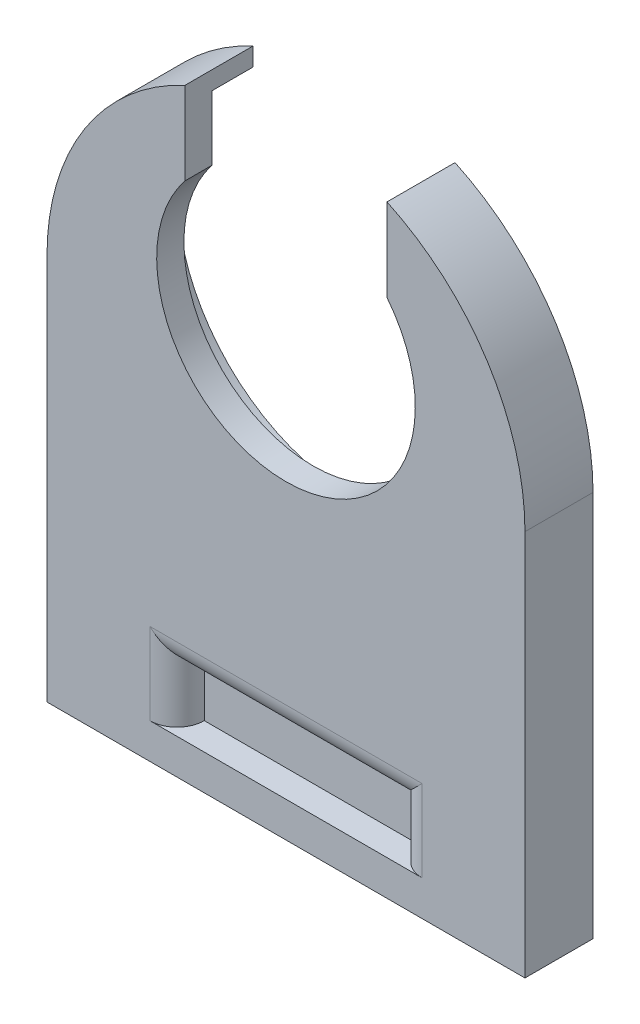
ISO-10303-21;
HEADER;
FILE_DESCRIPTION(('STEP AP214'),'2;1');
FILE_NAME('part.step','',(''),(''),'','','');
FILE_SCHEMA(('AUTOMOTIVE_DESIGN { 1 0 10303 214 1 1 1 1 }'));
ENDSEC;
DATA;
#1=APPLICATION_CONTEXT('core data for automotive mechanical design processes');
#2=APPLICATION_PROTOCOL_DEFINITION('international standard','automotive_design',2000,#1);
#3=PRODUCT_CONTEXT('',#1,'mechanical');
#4=PRODUCT('Part','Part','',(#3));
#5=PRODUCT_RELATED_PRODUCT_CATEGORY('part','',(#4));
#6=PRODUCT_DEFINITION_FORMATION('','',#4);
#7=PRODUCT_DEFINITION_CONTEXT('part definition',#1,'design');
#8=PRODUCT_DEFINITION('design','',#6,#7);
#9=PRODUCT_DEFINITION_SHAPE('','',#8);
#10=(LENGTH_UNIT() NAMED_UNIT(*) SI_UNIT(.MILLI.,.METRE.));
#11=(NAMED_UNIT(*) PLANE_ANGLE_UNIT() SI_UNIT($,.RADIAN.));
#12=(NAMED_UNIT(*) SI_UNIT($,.STERADIAN.) SOLID_ANGLE_UNIT());
#13=UNCERTAINTY_MEASURE_WITH_UNIT(LENGTH_MEASURE(1.E-05),#10,'distance_accuracy_value','');
#14=(GEOMETRIC_REPRESENTATION_CONTEXT(3) GLOBAL_UNCERTAINTY_ASSIGNED_CONTEXT((#13)) GLOBAL_UNIT_ASSIGNED_CONTEXT((#10,
#11,#12)) REPRESENTATION_CONTEXT('',''));
#15=CARTESIAN_POINT('',(0.,0.,0.));
#16=DIRECTION('',(0.,0.,1.));
#17=DIRECTION('',(1.,0.,0.));
#18=AXIS2_PLACEMENT_3D('',#15,#16,#17);
#19=CARTESIAN_POINT('',(8.78,8.5,1.5));
#20=DIRECTION('',(0.,0.,-1.));
#21=DIRECTION('',(-1.,0.,0.));
#22=AXIS2_PLACEMENT_3D('',#19,#20,#21);
#23=CYLINDRICAL_SURFACE('',#22,6.5);
#24=CARTESIAN_POINT('',(8.78,8.5,1.5));
#25=DIRECTION('',(0.,0.,1.));
#26=DIRECTION('',(1.,0.,0.));
#27=AXIS2_PLACEMENT_3D('',#24,#25,#26);
#28=CIRCLE('',#27,6.5);
#29=CARTESIAN_POINT('',(5.07,13.8372183766453,1.5));
#30=VERTEX_POINT('',#29);
#31=CARTESIAN_POINT('',(12.49,13.8372183766453,1.5));
#32=VERTEX_POINT('',#31);
#33=EDGE_CURVE('E151',#30,#32,#28,.T.);
#34=ORIENTED_EDGE('',*,*,#33,.T.);
#35=DIRECTION('',(0.,0.,-1.));
#36=VECTOR('',#35,1.);
#37=CARTESIAN_POINT('',(12.49,13.8372183766453,1.5));
#38=LINE('',#37,#36);
#39=CARTESIAN_POINT('',(12.49,13.8372183766453,0.));
#40=VERTEX_POINT('',#39);
#41=EDGE_CURVE('E137',#32,#40,#38,.T.);
#42=ORIENTED_EDGE('',*,*,#41,.T.);
#43=CARTESIAN_POINT('',(8.78,8.5,0.));
#44=DIRECTION('',(0.,0.,1.));
#45=DIRECTION('',(1.,0.,0.));
#46=AXIS2_PLACEMENT_3D('',#43,#44,#45);
#47=CIRCLE('',#46,6.5);
#48=CARTESIAN_POINT('',(5.07,13.8372183766453,0.));
#49=VERTEX_POINT('',#48);
#50=EDGE_CURVE('E149',#49,#40,#47,.T.);
#51=ORIENTED_EDGE('',*,*,#50,.F.);
#52=DIRECTION('',(0.,0.,-1.));
#53=VECTOR('',#52,1.);
#54=CARTESIAN_POINT('',(5.07,13.8372183766453,1.5));
#55=LINE('',#54,#53);
#56=EDGE_CURVE('E211',#49,#30,#55,.F.);
#57=ORIENTED_EDGE('',*,*,#56,.T.);
#58=EDGE_LOOP('',(#34,#42,#51,#57));
#59=FACE_BOUND('',#58,.T.);
#60=ADVANCED_FACE('F35',(#59),#23,.F.);
#61=CARTESIAN_POINT('',(0.,0.,0.));
#62=DIRECTION('',(0.,0.,1.));
#63=DIRECTION('',(1.,0.,0.));
#64=AXIS2_PLACEMENT_3D('',#61,#62,#63);
#65=PLANE('',#64);
#66=DIRECTION('',(0.,1.,0.));
#67=VECTOR('',#66,1.);
#68=CARTESIAN_POINT('',(12.49,14.6194981256581,0.));
#69=LINE('',#68,#67);
#70=CARTESIAN_POINT('',(12.49,14.5076566902575,0.));
#71=VERTEX_POINT('',#70);
#72=EDGE_CURVE('E134',#40,#71,#69,.T.);
#73=ORIENTED_EDGE('',*,*,#72,.T.);
#74=CARTESIAN_POINT('',(8.78,6.55,0.));
#75=DIRECTION('',(0.,0.,1.));
#76=DIRECTION('',(1.,0.,0.));
#77=AXIS2_PLACEMENT_3D('',#74,#75,#76);
#78=CIRCLE('',#77,8.78);
#79=CARTESIAN_POINT('',(17.56,6.55,0.));
#80=VERTEX_POINT('',#79);
#81=EDGE_CURVE('E173',#80,#71,#78,.T.);
#82=ORIENTED_EDGE('',*,*,#81,.F.);
#83=DIRECTION('',(0.,1.,0.));
#84=VECTOR('',#83,1.);
#85=CARTESIAN_POINT('',(17.56,0.,0.));
#86=LINE('',#85,#84);
#87=CARTESIAN_POINT('',(17.56,-7.65,0.));
#88=VERTEX_POINT('',#87);
#89=EDGE_CURVE('E171',#88,#80,#86,.T.);
#90=ORIENTED_EDGE('',*,*,#89,.F.);
#91=DIRECTION('',(1.,0.,0.));
#92=VECTOR('',#91,1.);
#93=CARTESIAN_POINT('',(0.,-7.65,0.));
#94=LINE('',#93,#92);
#95=CARTESIAN_POINT('',(0.,-7.65,0.));
#96=VERTEX_POINT('',#95);
#97=EDGE_CURVE('E235',#96,#88,#94,.T.);
#98=ORIENTED_EDGE('',*,*,#97,.F.);
#99=DIRECTION('',(0.,1.,0.));
#100=VECTOR('',#99,1.);
#101=CARTESIAN_POINT('',(0.,0.,0.));
#102=LINE('',#101,#100);
#103=CARTESIAN_POINT('',(0.,6.55,0.));
#104=VERTEX_POINT('',#103);
#105=EDGE_CURVE('E162',#96,#104,#102,.T.);
#106=ORIENTED_EDGE('',*,*,#105,.T.);
#107=CARTESIAN_POINT('',(8.78,6.55,0.));
#108=DIRECTION('',(0.,0.,1.));
#109=DIRECTION('',(1.,0.,0.));
#110=AXIS2_PLACEMENT_3D('',#107,#108,#109);
#111=CIRCLE('',#110,8.78);
#112=CARTESIAN_POINT('',(5.07,14.5076566902575,0.));
#113=VERTEX_POINT('',#112);
#114=EDGE_CURVE('E159',#113,#104,#111,.T.);
#115=ORIENTED_EDGE('',*,*,#114,.F.);
#116=DIRECTION('',(0.,1.,0.));
#117=VECTOR('',#116,1.);
#118=CARTESIAN_POINT('',(5.07,14.6194981256581,0.));
#119=LINE('',#118,#117);
#120=EDGE_CURVE('E158',#49,#113,#119,.T.);
#121=ORIENTED_EDGE('',*,*,#120,.F.);
#122=ORIENTED_EDGE('',*,*,#50,.T.);
#123=EDGE_LOOP('',(#73,#82,#90,#98,#106,#115,#121,#122));
#124=FACE_BOUND('',#123,.T.);
#125=ADVANCED_FACE('F156',(#124),#65,.F.);
#126=CARTESIAN_POINT('',(0.,0.,1.5));
#127=DIRECTION('',(0.,0.,1.));
#128=DIRECTION('',(1.,0.,0.));
#129=AXIS2_PLACEMENT_3D('',#126,#127,#128);
#130=PLANE('',#129);
#131=DIRECTION('',(0.,-1.,0.));
#132=VECTOR('',#131,1.);
#133=CARTESIAN_POINT('',(12.49,0.,1.5));
#134=LINE('',#133,#132);
#135=CARTESIAN_POINT('',(12.49,11.466209702634,1.5));
#136=VERTEX_POINT('',#135);
#137=EDGE_CURVE('E153',#32,#136,#134,.T.);
#138=ORIENTED_EDGE('',*,*,#137,.F.);
#139=ORIENTED_EDGE('',*,*,#33,.F.);
#140=DIRECTION('',(0.,1.,0.));
#141=VECTOR('',#140,1.);
#142=CARTESIAN_POINT('',(5.07,0.,1.5));
#143=LINE('',#142,#141);
#144=CARTESIAN_POINT('',(5.07,11.466209702634,1.5));
#145=VERTEX_POINT('',#144);
#146=EDGE_CURVE('E205',#145,#30,#143,.T.);
#147=ORIENTED_EDGE('',*,*,#146,.F.);
#148=CARTESIAN_POINT('',(8.78,8.5,1.5));
#149=DIRECTION('',(0.,0.,-1.));
#150=DIRECTION('',(-1.,0.,0.));
#151=AXIS2_PLACEMENT_3D('',#148,#149,#150);
#152=CIRCLE('',#151,4.75);
#153=EDGE_CURVE('E210',#136,#145,#152,.T.);
#154=ORIENTED_EDGE('',*,*,#153,.F.);
#155=EDGE_LOOP('',(#138,#139,#147,#154));
#156=FACE_BOUND('',#155,.T.);
#157=ADVANCED_FACE('F209',(#156),#130,.F.);
#158=CARTESIAN_POINT('',(0.,0.,2.5));
#159=DIRECTION('',(0.,0.,1.));
#160=DIRECTION('',(1.,0.,0.));
#161=AXIS2_PLACEMENT_3D('',#158,#159,#160);
#162=PLANE('',#161);
#163=DIRECTION('',(0.,1.,0.));
#164=VECTOR('',#163,1.);
#165=CARTESIAN_POINT('',(13.78,-6.35316683145248,2.5));
#166=LINE('',#165,#164);
#167=CARTESIAN_POINT('',(13.78,-3.35316683145248,2.5));
#168=VERTEX_POINT('',#167);
#169=CARTESIAN_POINT('',(13.78,-6.35316683145248,2.5));
#170=VERTEX_POINT('',#169);
#171=EDGE_CURVE('E183',#168,#170,#166,.F.);
#172=ORIENTED_EDGE('',*,*,#171,.T.);
#173=DIRECTION('',(1.,0.,0.));
#174=VECTOR('',#173,1.);
#175=CARTESIAN_POINT('',(12.78,-6.35316683145248,2.5));
#176=LINE('',#175,#174);
#177=CARTESIAN_POINT('',(3.78,-6.35316683145248,2.5));
#178=VERTEX_POINT('',#177);
#179=EDGE_CURVE('E199',#178,#170,#176,.T.);
#180=ORIENTED_EDGE('',*,*,#179,.F.);
#181=DIRECTION('',(0.,-1.,0.));
#182=VECTOR('',#181,1.);
#183=CARTESIAN_POINT('',(3.78,-4.35316683145248,2.5));
#184=LINE('',#183,#182);
#185=CARTESIAN_POINT('',(3.78,-3.35316683145248,2.5));
#186=VERTEX_POINT('',#185);
#187=EDGE_CURVE('E186',#178,#186,#184,.F.);
#188=ORIENTED_EDGE('',*,*,#187,.T.);
#189=DIRECTION('',(-1.,0.,0.));
#190=VECTOR('',#189,1.);
#191=CARTESIAN_POINT('',(12.78,-3.35316683145248,2.5));
#192=LINE('',#191,#190);
#193=EDGE_CURVE('E181',#186,#168,#192,.F.);
#194=ORIENTED_EDGE('',*,*,#193,.T.);
#195=EDGE_LOOP('',(#172,#180,#188,#194));
#196=FACE_BOUND('',#195,.T.);
#197=CARTESIAN_POINT('',(8.78,6.55,2.5));
#198=DIRECTION('',(0.,0.,1.));
#199=DIRECTION('',(1.,0.,0.));
#200=AXIS2_PLACEMENT_3D('',#197,#198,#199);
#201=CIRCLE('',#200,8.78);
#202=CARTESIAN_POINT('',(17.56,6.55,2.5));
#203=VERTEX_POINT('',#202);
#204=CARTESIAN_POINT('',(12.49,14.5076566902575,2.5));
#205=VERTEX_POINT('',#204);
#206=EDGE_CURVE('E242',#203,#205,#201,.T.);
#207=ORIENTED_EDGE('',*,*,#206,.T.);
#208=DIRECTION('',(0.,-1.,0.));
#209=VECTOR('',#208,1.);
#210=CARTESIAN_POINT('',(12.49,14.6194981256581,2.5));
#211=LINE('',#210,#209);
#212=CARTESIAN_POINT('',(12.49,11.466209702634,2.5));
#213=VERTEX_POINT('',#212);
#214=EDGE_CURVE('E49',#205,#213,#211,.T.);
#215=ORIENTED_EDGE('',*,*,#214,.T.);
#216=CARTESIAN_POINT('',(8.78,8.5,2.5));
#217=DIRECTION('',(0.,0.,-1.));
#218=DIRECTION('',(-1.,0.,0.));
#219=AXIS2_PLACEMENT_3D('',#216,#217,#218);
#220=CIRCLE('',#219,4.75);
#221=CARTESIAN_POINT('',(5.07,11.466209702634,2.5));
#222=VERTEX_POINT('',#221);
#223=EDGE_CURVE('E56',#213,#222,#220,.T.);
#224=ORIENTED_EDGE('',*,*,#223,.T.);
#225=DIRECTION('',(0.,-1.,0.));
#226=VECTOR('',#225,1.);
#227=CARTESIAN_POINT('',(5.07,14.6194981256581,2.5));
#228=LINE('',#227,#226);
#229=CARTESIAN_POINT('',(5.07,14.5076566902575,2.5));
#230=VERTEX_POINT('',#229);
#231=EDGE_CURVE('E152',#230,#222,#228,.T.);
#232=ORIENTED_EDGE('',*,*,#231,.F.);
#233=CARTESIAN_POINT('',(8.78,6.55,2.5));
#234=DIRECTION('',(0.,0.,1.));
#235=DIRECTION('',(1.,0.,0.));
#236=AXIS2_PLACEMENT_3D('',#233,#234,#235);
#237=CIRCLE('',#236,8.78);
#238=CARTESIAN_POINT('',(0.,6.55,2.5));
#239=VERTEX_POINT('',#238);
#240=EDGE_CURVE('E246',#230,#239,#237,.T.);
#241=ORIENTED_EDGE('',*,*,#240,.T.);
#242=DIRECTION('',(0.,-1.,0.));
#243=VECTOR('',#242,1.);
#244=CARTESIAN_POINT('',(0.,0.,2.5));
#245=LINE('',#244,#243);
#246=CARTESIAN_POINT('',(0.,-7.65,2.5));
#247=VERTEX_POINT('',#246);
#248=EDGE_CURVE('E165',#239,#247,#245,.T.);
#249=ORIENTED_EDGE('',*,*,#248,.T.);
#250=DIRECTION('',(-1.,0.,0.));
#251=VECTOR('',#250,1.);
#252=CARTESIAN_POINT('',(17.56,-7.65,2.5));
#253=LINE('',#252,#251);
#254=CARTESIAN_POINT('',(17.56,-7.65,2.5));
#255=VERTEX_POINT('',#254);
#256=EDGE_CURVE('E228',#255,#247,#253,.T.);
#257=ORIENTED_EDGE('',*,*,#256,.F.);
#258=DIRECTION('',(0.,1.,0.));
#259=VECTOR('',#258,1.);
#260=CARTESIAN_POINT('',(17.56,0.,2.5));
#261=LINE('',#260,#259);
#262=EDGE_CURVE('E160',#255,#203,#261,.T.);
#263=ORIENTED_EDGE('',*,*,#262,.T.);
#264=EDGE_LOOP('',(#207,#215,#224,#232,#241,#249,#257,#263));
#265=FACE_BOUND('',#264,.T.);
#266=ADVANCED_FACE('F251',(#196,#265),#162,.T.);
#267=CARTESIAN_POINT('',(8.78,8.5,2.5));
#268=DIRECTION('',(0.,0.,-1.));
#269=DIRECTION('',(-1.,0.,0.));
#270=AXIS2_PLACEMENT_3D('',#267,#268,#269);
#271=CYLINDRICAL_SURFACE('',#270,4.75);
#272=DIRECTION('',(0.,0.,-1.));
#273=VECTOR('',#272,1.);
#274=CARTESIAN_POINT('',(12.49,11.466209702634,2.5));
#275=LINE('',#274,#273);
#276=EDGE_CURVE('E143',#136,#213,#275,.F.);
#277=ORIENTED_EDGE('',*,*,#276,.F.);
#278=ORIENTED_EDGE('',*,*,#153,.T.);
#279=DIRECTION('',(0.,0.,-1.));
#280=VECTOR('',#279,1.);
#281=CARTESIAN_POINT('',(5.07,11.466209702634,2.5));
#282=LINE('',#281,#280);
#283=EDGE_CURVE('E43',#222,#145,#282,.T.);
#284=ORIENTED_EDGE('',*,*,#283,.F.);
#285=ORIENTED_EDGE('',*,*,#223,.F.);
#286=EDGE_LOOP('',(#277,#278,#284,#285));
#287=FACE_BOUND('',#286,.T.);
#288=ADVANCED_FACE('F272',(#287),#271,.F.);
#289=CARTESIAN_POINT('',(8.78,6.55,1.5));
#290=DIRECTION('',(0.,0.,-1.));
#291=DIRECTION('',(-1.,0.,0.));
#292=AXIS2_PLACEMENT_3D('',#289,#290,#291);
#293=CYLINDRICAL_SURFACE('',#292,8.78);
#294=DIRECTION('',(0.,0.,-1.));
#295=VECTOR('',#294,1.);
#296=CARTESIAN_POINT('',(12.49,14.5076566902575,1.5));
#297=LINE('',#296,#295);
#298=EDGE_CURVE('E11',#205,#71,#297,.T.);
#299=ORIENTED_EDGE('',*,*,#298,.F.);
#300=ORIENTED_EDGE('',*,*,#206,.F.);
#301=DIRECTION('',(0.,0.,-1.));
#302=VECTOR('',#301,1.);
#303=CARTESIAN_POINT('',(17.56,6.55,1.5));
#304=LINE('',#303,#302);
#305=EDGE_CURVE('E175',#203,#80,#304,.T.);
#306=ORIENTED_EDGE('',*,*,#305,.T.);
#307=ORIENTED_EDGE('',*,*,#81,.T.);
#308=EDGE_LOOP('',(#299,#300,#306,#307));
#309=FACE_BOUND('',#308,.T.);
#310=ADVANCED_FACE('F264',(#309),#293,.T.);
#311=CARTESIAN_POINT('',(8.78,6.55,1.5));
#312=DIRECTION('',(0.,0.,-1.));
#313=DIRECTION('',(-1.,0.,0.));
#314=AXIS2_PLACEMENT_3D('',#311,#312,#313);
#315=CYLINDRICAL_SURFACE('',#314,8.78);
#316=DIRECTION('',(0.,0.,-1.));
#317=VECTOR('',#316,1.);
#318=CARTESIAN_POINT('',(5.07,14.5076566902575,1.5));
#319=LINE('',#318,#317);
#320=EDGE_CURVE('E197',#113,#230,#319,.F.);
#321=ORIENTED_EDGE('',*,*,#320,.F.);
#322=ORIENTED_EDGE('',*,*,#114,.T.);
#323=DIRECTION('',(0.,0.,-1.));
#324=VECTOR('',#323,1.);
#325=CARTESIAN_POINT('',(0.,6.55,1.5));
#326=LINE('',#325,#324);
#327=EDGE_CURVE('E178',#239,#104,#326,.T.);
#328=ORIENTED_EDGE('',*,*,#327,.F.);
#329=ORIENTED_EDGE('',*,*,#240,.F.);
#330=EDGE_LOOP('',(#321,#322,#328,#329));
#331=FACE_BOUND('',#330,.T.);
#332=ADVANCED_FACE('F267',(#331),#315,.T.);
#333=CARTESIAN_POINT('',(0.,0.,1.5));
#334=DIRECTION('',(-1.,0.,0.));
#335=DIRECTION('',(0.,0.,1.));
#336=AXIS2_PLACEMENT_3D('',#333,#334,#335);
#337=PLANE('',#336);
#338=ORIENTED_EDGE('',*,*,#105,.F.);
#339=DIRECTION('',(0.,0.,-1.));
#340=VECTOR('',#339,1.);
#341=CARTESIAN_POINT('',(0.,-7.65,2.5));
#342=LINE('',#341,#340);
#343=EDGE_CURVE('E232',#247,#96,#342,.T.);
#344=ORIENTED_EDGE('',*,*,#343,.F.);
#345=ORIENTED_EDGE('',*,*,#248,.F.);
#346=ORIENTED_EDGE('',*,*,#327,.T.);
#347=EDGE_LOOP('',(#338,#344,#345,#346));
#348=FACE_BOUND('',#347,.T.);
#349=ADVANCED_FACE('F255',(#348),#337,.T.);
#350=CARTESIAN_POINT('',(17.56,0.,1.5));
#351=DIRECTION('',(-1.,0.,0.));
#352=DIRECTION('',(0.,0.,1.));
#353=AXIS2_PLACEMENT_3D('',#350,#351,#352);
#354=PLANE('',#353);
#355=ORIENTED_EDGE('',*,*,#89,.T.);
#356=ORIENTED_EDGE('',*,*,#305,.F.);
#357=ORIENTED_EDGE('',*,*,#262,.F.);
#358=DIRECTION('',(0.,0.,1.));
#359=VECTOR('',#358,1.);
#360=CARTESIAN_POINT('',(17.56,-7.65,0.));
#361=LINE('',#360,#359);
#362=EDGE_CURVE('E238',#88,#255,#361,.T.);
#363=ORIENTED_EDGE('',*,*,#362,.F.);
#364=EDGE_LOOP('',(#355,#356,#357,#363));
#365=FACE_BOUND('',#364,.T.);
#366=ADVANCED_FACE('F261',(#365),#354,.F.);
#367=CARTESIAN_POINT('',(0.,-7.65,0.));
#368=DIRECTION('',(0.,-1.,0.));
#369=DIRECTION('',(0.,0.,-1.));
#370=AXIS2_PLACEMENT_3D('',#367,#368,#369);
#371=PLANE('',#370);
#372=ORIENTED_EDGE('',*,*,#256,.T.);
#373=ORIENTED_EDGE('',*,*,#343,.T.);
#374=ORIENTED_EDGE('',*,*,#97,.T.);
#375=ORIENTED_EDGE('',*,*,#362,.T.);
#376=EDGE_LOOP('',(#372,#373,#374,#375));
#377=FACE_BOUND('',#376,.T.);
#378=ADVANCED_FACE('F258',(#377),#371,.T.);
#379=CARTESIAN_POINT('',(12.78,-6.35316683145248,1.5));
#380=DIRECTION('',(0.,-1.,0.));
#381=DIRECTION('',(1.,0.,0.));
#382=AXIS2_PLACEMENT_3D('',#379,#380,#381);
#383=PLANE('',#382);
#384=ORIENTED_EDGE('',*,*,#179,.T.);
#385=CARTESIAN_POINT('',(13.78,-6.35316683145248,1.5));
#386=DIRECTION('',(0.,-1.,0.));
#387=DIRECTION('',(1.,0.,0.));
#388=AXIS2_PLACEMENT_3D('',#385,#386,#387);
#389=CIRCLE('',#388,1.);
#390=CARTESIAN_POINT('',(12.78,-6.35316683145248,1.5));
#391=VERTEX_POINT('',#390);
#392=EDGE_CURVE('E191',#170,#391,#389,.T.);
#393=ORIENTED_EDGE('',*,*,#392,.T.);
#394=DIRECTION('',(1.,0.,0.));
#395=VECTOR('',#394,1.);
#396=CARTESIAN_POINT('',(12.78,-6.35316683145248,1.5));
#397=LINE('',#396,#395);
#398=CARTESIAN_POINT('',(4.78,-6.35316683145248,1.5));
#399=VERTEX_POINT('',#398);
#400=EDGE_CURVE('E225',#399,#391,#397,.T.);
#401=ORIENTED_EDGE('',*,*,#400,.F.);
#402=CARTESIAN_POINT('',(3.78,-6.35316683145248,1.5));
#403=DIRECTION('',(0.,-1.,0.));
#404=DIRECTION('',(1.,0.,0.));
#405=AXIS2_PLACEMENT_3D('',#402,#403,#404);
#406=CIRCLE('',#405,1.);
#407=EDGE_CURVE('E188',#399,#178,#406,.T.);
#408=ORIENTED_EDGE('',*,*,#407,.T.);
#409=EDGE_LOOP('',(#384,#393,#401,#408));
#410=FACE_BOUND('',#409,.T.);
#411=ADVANCED_FACE('F316',(#410),#383,.F.);
#412=CARTESIAN_POINT('',(0.,0.,1.5));
#413=DIRECTION('',(0.,0.,1.));
#414=DIRECTION('',(1.,0.,0.));
#415=AXIS2_PLACEMENT_3D('',#412,#413,#414);
#416=PLANE('',#415);
#417=DIRECTION('',(0.,1.,0.));
#418=VECTOR('',#417,1.);
#419=CARTESIAN_POINT('',(12.78,-6.35316683145248,1.5));
#420=LINE('',#419,#418);
#421=CARTESIAN_POINT('',(12.78,-4.35316683145248,1.5));
#422=VERTEX_POINT('',#421);
#423=EDGE_CURVE('E218',#391,#422,#420,.T.);
#424=ORIENTED_EDGE('',*,*,#423,.T.);
#425=DIRECTION('',(-1.,0.,0.));
#426=VECTOR('',#425,1.);
#427=CARTESIAN_POINT('',(12.78,-4.35316683145248,1.5));
#428=LINE('',#427,#426);
#429=CARTESIAN_POINT('',(4.78,-4.35316683145248,1.5));
#430=VERTEX_POINT('',#429);
#431=EDGE_CURVE('E220',#422,#430,#428,.T.);
#432=ORIENTED_EDGE('',*,*,#431,.T.);
#433=DIRECTION('',(0.,-1.,0.));
#434=VECTOR('',#433,1.);
#435=CARTESIAN_POINT('',(4.78,-6.35316683145248,1.5));
#436=LINE('',#435,#434);
#437=EDGE_CURVE('E222',#430,#399,#436,.T.);
#438=ORIENTED_EDGE('',*,*,#437,.T.);
#439=ORIENTED_EDGE('',*,*,#400,.T.);
#440=EDGE_LOOP('',(#424,#432,#438,#439));
#441=FACE_BOUND('',#440,.T.);
#442=ADVANCED_FACE('F302',(#441),#416,.T.);
#443=CARTESIAN_POINT('',(13.78,-6.35316683145248,1.5));
#444=DIRECTION('',(0.,-1.,0.));
#445=DIRECTION('',(0.,0.,-1.));
#446=AXIS2_PLACEMENT_3D('',#443,#444,#445);
#447=CYLINDRICAL_SURFACE('',#446,1.);
#448=ORIENTED_EDGE('',*,*,#392,.F.);
#449=ORIENTED_EDGE('',*,*,#171,.F.);
#450=CARTESIAN_POINT('',(13.78,-3.35316683145248,1.5));
#451=DIRECTION('',(0.707106781186547,-0.707106781186547,0.));
#452=DIRECTION('',(-0.707106781186547,-0.707106781186547,0.));
#453=AXIS2_PLACEMENT_3D('',#450,#451,#452);
#454=ELLIPSE('',#453,1.41421356237309,1.);
#455=EDGE_CURVE('E196',#422,#168,#454,.F.);
#456=ORIENTED_EDGE('',*,*,#455,.F.);
#457=ORIENTED_EDGE('',*,*,#423,.F.);
#458=EDGE_LOOP('',(#448,#449,#456,#457));
#459=FACE_BOUND('',#458,.T.);
#460=ADVANCED_FACE('F37',(#459),#447,.T.);
#461=CARTESIAN_POINT('',(12.78,-3.35316683145248,1.5));
#462=DIRECTION('',(1.,0.,0.));
#463=DIRECTION('',(0.,0.,-1.));
#464=AXIS2_PLACEMENT_3D('',#461,#462,#463);
#465=CYLINDRICAL_SURFACE('',#464,1.);
#466=ORIENTED_EDGE('',*,*,#455,.T.);
#467=ORIENTED_EDGE('',*,*,#193,.F.);
#468=CARTESIAN_POINT('',(3.78,-3.35316683145248,1.5));
#469=DIRECTION('',(0.707106781186547,0.707106781186547,0.));
#470=DIRECTION('',(-0.707106781186547,0.707106781186547,0.));
#471=AXIS2_PLACEMENT_3D('',#468,#469,#470);
#472=ELLIPSE('',#471,1.41421356237309,1.);
#473=EDGE_CURVE('E193',#430,#186,#472,.F.);
#474=ORIENTED_EDGE('',*,*,#473,.F.);
#475=ORIENTED_EDGE('',*,*,#431,.F.);
#476=EDGE_LOOP('',(#466,#467,#474,#475));
#477=FACE_BOUND('',#476,.T.);
#478=ADVANCED_FACE('F295',(#477),#465,.T.);
#479=CARTESIAN_POINT('',(3.78,-6.35316683145248,1.5));
#480=DIRECTION('',(0.,1.,0.));
#481=DIRECTION('',(0.,0.,1.));
#482=AXIS2_PLACEMENT_3D('',#479,#480,#481);
#483=CYLINDRICAL_SURFACE('',#482,1.);
#484=ORIENTED_EDGE('',*,*,#473,.T.);
#485=ORIENTED_EDGE('',*,*,#187,.F.);
#486=ORIENTED_EDGE('',*,*,#407,.F.);
#487=ORIENTED_EDGE('',*,*,#437,.F.);
#488=EDGE_LOOP('',(#484,#485,#486,#487));
#489=FACE_BOUND('',#488,.T.);
#490=ADVANCED_FACE('F293',(#489),#483,.T.);
#491=CARTESIAN_POINT('',(5.07,0.,0.));
#492=DIRECTION('',(1.,0.,0.));
#493=DIRECTION('',(0.,0.,-1.));
#494=AXIS2_PLACEMENT_3D('',#491,#492,#493);
#495=PLANE('',#494);
#496=ORIENTED_EDGE('',*,*,#320,.T.);
#497=ORIENTED_EDGE('',*,*,#231,.T.);
#498=ORIENTED_EDGE('',*,*,#283,.T.);
#499=ORIENTED_EDGE('',*,*,#146,.T.);
#500=ORIENTED_EDGE('',*,*,#56,.F.);
#501=ORIENTED_EDGE('',*,*,#120,.T.);
#502=EDGE_LOOP('',(#496,#497,#498,#499,#500,#501));
#503=FACE_BOUND('',#502,.T.);
#504=ADVANCED_FACE('F204',(#503),#495,.T.);
#505=CARTESIAN_POINT('',(12.49,0.,0.));
#506=DIRECTION('',(-1.,0.,0.));
#507=DIRECTION('',(0.,0.,-1.));
#508=AXIS2_PLACEMENT_3D('',#505,#506,#507);
#509=PLANE('',#508);
#510=ORIENTED_EDGE('',*,*,#137,.T.);
#511=ORIENTED_EDGE('',*,*,#276,.T.);
#512=ORIENTED_EDGE('',*,*,#214,.F.);
#513=ORIENTED_EDGE('',*,*,#298,.T.);
#514=ORIENTED_EDGE('',*,*,#72,.F.);
#515=ORIENTED_EDGE('',*,*,#41,.F.);
#516=EDGE_LOOP('',(#510,#511,#512,#513,#514,#515));
#517=FACE_BOUND('',#516,.T.);
#518=ADVANCED_FACE('F136',(#517),#509,.T.);
#519=CLOSED_SHELL('',(#60,#125,#157,#266,#288,#310,#332,#349,#366,#378,#411,#442,#460,#478,#490,
#504,#518));
#520=MANIFOLD_SOLID_BREP('B2',#519);
#521=ADVANCED_BREP_SHAPE_REPRESENTATION('',(#18,#520),#14);
#522=SHAPE_DEFINITION_REPRESENTATION(#9,#521);
ENDSEC;
END-ISO-10303-21;
